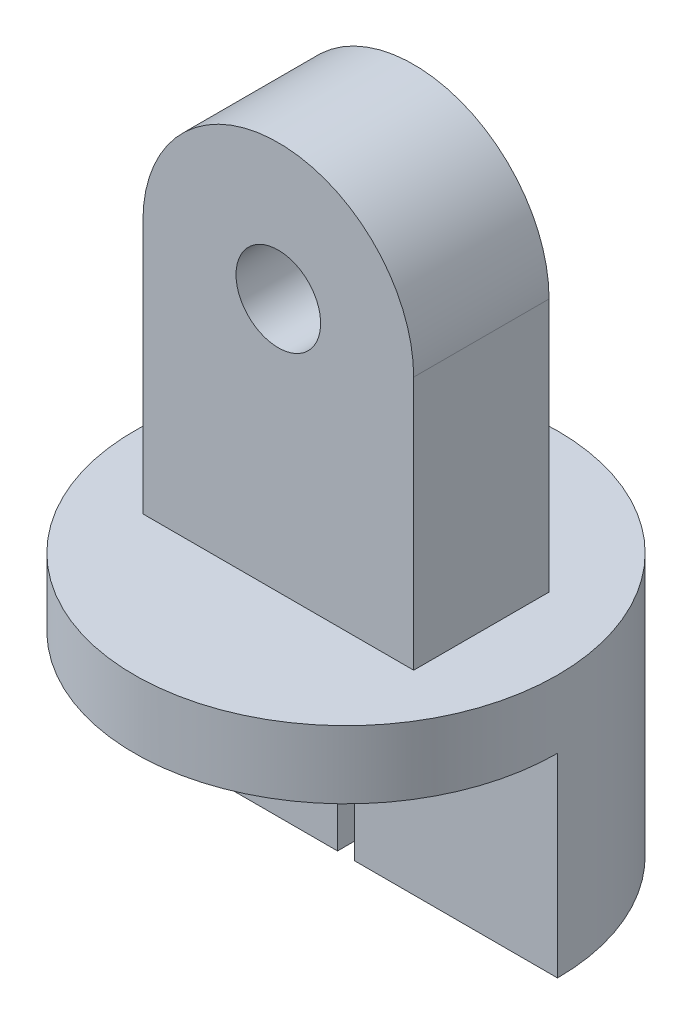
ISO-10303-21;
HEADER;
FILE_DESCRIPTION(('STEP AP214'),'2;1');
FILE_NAME('part.step','',(''),(''),'','','');
FILE_SCHEMA(('AUTOMOTIVE_DESIGN { 1 0 10303 214 1 1 1 1 }'));
ENDSEC;
DATA;
#1=APPLICATION_CONTEXT('core data for automotive mechanical design processes');
#2=APPLICATION_PROTOCOL_DEFINITION('international standard','automotive_design',2000,#1);
#3=PRODUCT_CONTEXT('',#1,'mechanical');
#4=PRODUCT('Part','Part','',(#3));
#5=PRODUCT_RELATED_PRODUCT_CATEGORY('part','',(#4));
#6=PRODUCT_DEFINITION_FORMATION('','',#4);
#7=PRODUCT_DEFINITION_CONTEXT('part definition',#1,'design');
#8=PRODUCT_DEFINITION('design','',#6,#7);
#9=PRODUCT_DEFINITION_SHAPE('','',#8);
#10=(LENGTH_UNIT() NAMED_UNIT(*) SI_UNIT(.MILLI.,.METRE.));
#11=(NAMED_UNIT(*) PLANE_ANGLE_UNIT() SI_UNIT($,.RADIAN.));
#12=(NAMED_UNIT(*) SI_UNIT($,.STERADIAN.) SOLID_ANGLE_UNIT());
#13=UNCERTAINTY_MEASURE_WITH_UNIT(LENGTH_MEASURE(1.E-05),#10,'distance_accuracy_value','');
#14=(GEOMETRIC_REPRESENTATION_CONTEXT(3) GLOBAL_UNCERTAINTY_ASSIGNED_CONTEXT((#13)) GLOBAL_UNIT_ASSIGNED_CONTEXT((#10,
#11,#12)) REPRESENTATION_CONTEXT('',''));
#15=CARTESIAN_POINT('',(0.,0.,0.));
#16=DIRECTION('',(0.,0.,1.));
#17=DIRECTION('',(1.,0.,0.));
#18=AXIS2_PLACEMENT_3D('',#15,#16,#17);
#19=CARTESIAN_POINT('',(10.5,-20.5,0.));
#20=DIRECTION('',(0.,0.,-1.));
#21=DIRECTION('',(-1.,0.,0.));
#22=AXIS2_PLACEMENT_3D('',#19,#20,#21);
#23=PLANE('',#22);
#24=DIRECTION('',(-1.,0.,0.));
#25=VECTOR('',#24,1.);
#26=CARTESIAN_POINT('',(-12.5,-20.5,0.));
#27=LINE('',#26,#25);
#28=CARTESIAN_POINT('',(10.5,-20.5,0.));
#29=VERTEX_POINT('',#28);
#30=CARTESIAN_POINT('',(0.500000000000001,-20.5,0.));
#31=VERTEX_POINT('',#30);
#32=EDGE_CURVE('E148',#29,#31,#27,.T.);
#33=ORIENTED_EDGE('',*,*,#32,.T.);
#34=DIRECTION('',(0.,-1.,0.));
#35=VECTOR('',#34,1.);
#36=CARTESIAN_POINT('',(0.500000000000001,8.001,0.));
#37=LINE('',#36,#35);
#38=CARTESIAN_POINT('',(0.500000000000001,-30.5,0.));
#39=VERTEX_POINT('',#38);
#40=EDGE_CURVE('E141',#31,#39,#37,.T.);
#41=ORIENTED_EDGE('',*,*,#40,.T.);
#42=DIRECTION('',(-1.,0.,0.));
#43=VECTOR('',#42,1.);
#44=CARTESIAN_POINT('',(-12.5,-30.5,0.));
#45=LINE('',#44,#43);
#46=CARTESIAN_POINT('',(12.5,-30.5,0.));
#47=VERTEX_POINT('',#46);
#48=EDGE_CURVE('E161',#47,#39,#45,.T.);
#49=ORIENTED_EDGE('',*,*,#48,.F.);
#50=DIRECTION('',(0.,1.,0.));
#51=VECTOR('',#50,1.);
#52=CARTESIAN_POINT('',(12.5,-20.5,0.));
#53=LINE('',#52,#51);
#54=CARTESIAN_POINT('',(12.5,-19.,0.));
#55=VERTEX_POINT('',#54);
#56=EDGE_CURVE('E179',#47,#55,#53,.T.);
#57=ORIENTED_EDGE('',*,*,#56,.T.);
#58=DIRECTION('',(-1.,0.,0.));
#59=VECTOR('',#58,1.);
#60=CARTESIAN_POINT('',(10.5,-19.,0.));
#61=LINE('',#60,#59);
#62=CARTESIAN_POINT('',(10.5,-19.,0.));
#63=VERTEX_POINT('',#62);
#64=EDGE_CURVE('E163',#55,#63,#61,.T.);
#65=ORIENTED_EDGE('',*,*,#64,.T.);
#66=DIRECTION('',(0.,1.,0.));
#67=VECTOR('',#66,1.);
#68=CARTESIAN_POINT('',(10.5,-20.5,0.));
#69=LINE('',#68,#67);
#70=EDGE_CURVE('E177',#29,#63,#69,.T.);
#71=ORIENTED_EDGE('',*,*,#70,.F.);
#72=EDGE_LOOP('',(#33,#41,#49,#57,#65,#71));
#73=FACE_BOUND('',#72,.T.);
#74=ADVANCED_FACE('F33',(#73),#23,.F.);
#75=CARTESIAN_POINT('',(0.,0.,4.));
#76=DIRECTION('',(0.,0.,-1.));
#77=DIRECTION('',(-1.,0.,0.));
#78=AXIS2_PLACEMENT_3D('',#75,#76,#77);
#79=CYLINDRICAL_SURFACE('',#78,8.);
#80=CARTESIAN_POINT('',(0.,0.,-4.));
#81=DIRECTION('',(0.,0.,1.));
#82=DIRECTION('',(1.,0.,0.));
#83=AXIS2_PLACEMENT_3D('',#80,#81,#82);
#84=CIRCLE('',#83,8.);
#85=CARTESIAN_POINT('',(8.,0.,-4.));
#86=VERTEX_POINT('',#85);
#87=CARTESIAN_POINT('',(-8.,0.,-4.));
#88=VERTEX_POINT('',#87);
#89=EDGE_CURVE('E201',#86,#88,#84,.T.);
#90=ORIENTED_EDGE('',*,*,#89,.T.);
#91=DIRECTION('',(0.,0.,-1.));
#92=VECTOR('',#91,1.);
#93=CARTESIAN_POINT('',(-8.,0.,4.));
#94=LINE('',#93,#92);
#95=CARTESIAN_POINT('',(-8.,0.,4.));
#96=VERTEX_POINT('',#95);
#97=EDGE_CURVE('E11',#96,#88,#94,.T.);
#98=ORIENTED_EDGE('',*,*,#97,.F.);
#99=CARTESIAN_POINT('',(0.,0.,4.));
#100=DIRECTION('',(0.,0.,1.));
#101=DIRECTION('',(1.,0.,0.));
#102=AXIS2_PLACEMENT_3D('',#99,#100,#101);
#103=CIRCLE('',#102,8.);
#104=CARTESIAN_POINT('',(8.,0.,4.));
#105=VERTEX_POINT('',#104);
#106=EDGE_CURVE('E205',#105,#96,#103,.T.);
#107=ORIENTED_EDGE('',*,*,#106,.F.);
#108=DIRECTION('',(0.,0.,-1.));
#109=VECTOR('',#108,1.);
#110=CARTESIAN_POINT('',(8.,0.,4.));
#111=LINE('',#110,#109);
#112=EDGE_CURVE('E215',#105,#86,#111,.T.);
#113=ORIENTED_EDGE('',*,*,#112,.T.);
#114=EDGE_LOOP('',(#90,#98,#107,#113));
#115=FACE_BOUND('',#114,.T.);
#116=ADVANCED_FACE('F35',(#115),#79,.T.);
#117=CARTESIAN_POINT('',(-8.,0.,4.));
#118=DIRECTION('',(1.,0.,0.));
#119=DIRECTION('',(0.,1.,0.));
#120=AXIS2_PLACEMENT_3D('',#117,#118,#119);
#121=PLANE('',#120);
#122=DIRECTION('',(0.,-1.,0.));
#123=VECTOR('',#122,1.);
#124=CARTESIAN_POINT('',(-8.,0.,-4.));
#125=LINE('',#124,#123);
#126=CARTESIAN_POINT('',(-8.00000000000001,-15.,-4.));
#127=VERTEX_POINT('',#126);
#128=EDGE_CURVE('E218',#88,#127,#125,.T.);
#129=ORIENTED_EDGE('',*,*,#128,.T.);
#130=DIRECTION('',(0.,0.,-1.));
#131=VECTOR('',#130,1.);
#132=CARTESIAN_POINT('',(-8.00000000000001,-15.,4.));
#133=LINE('',#132,#131);
#134=CARTESIAN_POINT('',(-8.00000000000001,-15.,4.));
#135=VERTEX_POINT('',#134);
#136=EDGE_CURVE('E43',#135,#127,#133,.T.);
#137=ORIENTED_EDGE('',*,*,#136,.F.);
#138=DIRECTION('',(0.,-1.,0.));
#139=VECTOR('',#138,1.);
#140=CARTESIAN_POINT('',(-8.,0.,4.));
#141=LINE('',#140,#139);
#142=EDGE_CURVE('E208',#96,#135,#141,.T.);
#143=ORIENTED_EDGE('',*,*,#142,.F.);
#144=ORIENTED_EDGE('',*,*,#97,.T.);
#145=EDGE_LOOP('',(#129,#137,#143,#144));
#146=FACE_BOUND('',#145,.T.);
#147=ADVANCED_FACE('F277',(#146),#121,.F.);
#148=CARTESIAN_POINT('',(8.,0.,4.));
#149=DIRECTION('',(-1.,0.,0.));
#150=DIRECTION('',(0.,-1.,0.));
#151=AXIS2_PLACEMENT_3D('',#148,#149,#150);
#152=PLANE('',#151);
#153=DIRECTION('',(0.,1.,0.));
#154=VECTOR('',#153,1.);
#155=CARTESIAN_POINT('',(8.,0.,-4.));
#156=LINE('',#155,#154);
#157=CARTESIAN_POINT('',(8.00000000000001,-15.,-4.));
#158=VERTEX_POINT('',#157);
#159=EDGE_CURVE('E209',#158,#86,#156,.T.);
#160=ORIENTED_EDGE('',*,*,#159,.T.);
#161=ORIENTED_EDGE('',*,*,#112,.F.);
#162=DIRECTION('',(0.,1.,0.));
#163=VECTOR('',#162,1.);
#164=CARTESIAN_POINT('',(8.,0.,4.));
#165=LINE('',#164,#163);
#166=CARTESIAN_POINT('',(8.00000000000001,-15.,4.));
#167=VERTEX_POINT('',#166);
#168=EDGE_CURVE('E213',#167,#105,#165,.T.);
#169=ORIENTED_EDGE('',*,*,#168,.F.);
#170=DIRECTION('',(0.,0.,-1.));
#171=VECTOR('',#170,1.);
#172=CARTESIAN_POINT('',(8.00000000000001,-15.,4.));
#173=LINE('',#172,#171);
#174=EDGE_CURVE('E226',#167,#158,#173,.T.);
#175=ORIENTED_EDGE('',*,*,#174,.T.);
#176=EDGE_LOOP('',(#160,#161,#169,#175));
#177=FACE_BOUND('',#176,.T.);
#178=ADVANCED_FACE('F305',(#177),#152,.F.);
#179=CARTESIAN_POINT('',(0.,0.,4.));
#180=DIRECTION('',(0.,0.,1.));
#181=DIRECTION('',(1.,0.,0.));
#182=AXIS2_PLACEMENT_3D('',#179,#180,#181);
#183=PLANE('',#182);
#184=CARTESIAN_POINT('',(0.,0.,4.));
#185=DIRECTION('',(0.,0.,-1.));
#186=DIRECTION('',(-1.,0.,0.));
#187=AXIS2_PLACEMENT_3D('',#184,#185,#186);
#188=CIRCLE('',#187,2.5);
#189=CARTESIAN_POINT('',(-2.5,0.,4.));
#190=VERTEX_POINT('',#189);
#191=EDGE_CURVE('E198',#190,#190,#188,.T.);
#192=ORIENTED_EDGE('',*,*,#191,.T.);
#193=EDGE_LOOP('',(#192));
#194=FACE_BOUND('',#193,.T.);
#195=ORIENTED_EDGE('',*,*,#106,.T.);
#196=ORIENTED_EDGE('',*,*,#142,.T.);
#197=DIRECTION('',(1.,0.,0.));
#198=VECTOR('',#197,1.);
#199=CARTESIAN_POINT('',(8.00000000000001,-15.,4.));
#200=LINE('',#199,#198);
#201=EDGE_CURVE('E211',#135,#167,#200,.T.);
#202=ORIENTED_EDGE('',*,*,#201,.T.);
#203=ORIENTED_EDGE('',*,*,#168,.T.);
#204=EDGE_LOOP('',(#195,#196,#202,#203));
#205=FACE_BOUND('',#204,.T.);
#206=ADVANCED_FACE('F302',(#194,#205),#183,.T.);
#207=CARTESIAN_POINT('',(0.,0.,-4.));
#208=DIRECTION('',(0.,0.,1.));
#209=DIRECTION('',(1.,0.,0.));
#210=AXIS2_PLACEMENT_3D('',#207,#208,#209);
#211=PLANE('',#210);
#212=CARTESIAN_POINT('',(0.,0.,-4.));
#213=DIRECTION('',(0.,0.,-1.));
#214=DIRECTION('',(-1.,0.,0.));
#215=AXIS2_PLACEMENT_3D('',#212,#213,#214);
#216=CIRCLE('',#215,2.5);
#217=CARTESIAN_POINT('',(-2.5,0.,-4.));
#218=VERTEX_POINT('',#217);
#219=EDGE_CURVE('E202',#218,#218,#216,.T.);
#220=ORIENTED_EDGE('',*,*,#219,.F.);
#221=EDGE_LOOP('',(#220));
#222=FACE_BOUND('',#221,.T.);
#223=ORIENTED_EDGE('',*,*,#89,.F.);
#224=ORIENTED_EDGE('',*,*,#159,.F.);
#225=DIRECTION('',(1.,0.,0.));
#226=VECTOR('',#225,1.);
#227=CARTESIAN_POINT('',(8.00000000000001,-15.,-4.));
#228=LINE('',#227,#226);
#229=EDGE_CURVE('E220',#127,#158,#228,.T.);
#230=ORIENTED_EDGE('',*,*,#229,.F.);
#231=ORIENTED_EDGE('',*,*,#128,.F.);
#232=EDGE_LOOP('',(#223,#224,#230,#231));
#233=FACE_BOUND('',#232,.T.);
#234=ADVANCED_FACE('F300',(#222,#233),#211,.F.);
#235=CARTESIAN_POINT('',(0.,0.,4.));
#236=DIRECTION('',(0.,0.,-1.));
#237=DIRECTION('',(-1.,0.,0.));
#238=AXIS2_PLACEMENT_3D('',#235,#236,#237);
#239=CYLINDRICAL_SURFACE('',#238,2.5);
#240=ORIENTED_EDGE('',*,*,#191,.F.);
#241=EDGE_LOOP('',(#240));
#242=FACE_BOUND('',#241,.T.);
#243=ORIENTED_EDGE('',*,*,#219,.T.);
#244=EDGE_LOOP('',(#243));
#245=FACE_BOUND('',#244,.T.);
#246=ADVANCED_FACE('F297',(#242,#245),#239,.F.);
#247=CARTESIAN_POINT('',(0.,-19.,0.));
#248=DIRECTION('',(0.,1.,0.));
#249=DIRECTION('',(0.,0.,1.));
#250=AXIS2_PLACEMENT_3D('',#247,#248,#249);
#251=CYLINDRICAL_SURFACE('',#250,12.5);
#252=CARTESIAN_POINT('',(0.,-19.,0.));
#253=DIRECTION('',(0.,-1.,0.));
#254=DIRECTION('',(0.,0.,-1.));
#255=AXIS2_PLACEMENT_3D('',#252,#253,#254);
#256=CIRCLE('',#255,12.5);
#257=CARTESIAN_POINT('',(-12.5,-19.,0.));
#258=VERTEX_POINT('',#257);
#259=EDGE_CURVE('E197',#55,#258,#256,.T.);
#260=ORIENTED_EDGE('',*,*,#259,.F.);
#261=ORIENTED_EDGE('',*,*,#56,.F.);
#262=CARTESIAN_POINT('',(0.,-30.5,0.));
#263=DIRECTION('',(0.,-1.,0.));
#264=DIRECTION('',(0.,0.,-1.));
#265=AXIS2_PLACEMENT_3D('',#262,#263,#264);
#266=CIRCLE('',#265,12.5);
#267=CARTESIAN_POINT('',(-12.5,-30.5,0.));
#268=VERTEX_POINT('',#267);
#269=EDGE_CURVE('E150',#268,#47,#266,.T.);
#270=ORIENTED_EDGE('',*,*,#269,.F.);
#271=DIRECTION('',(0.,1.,0.));
#272=VECTOR('',#271,1.);
#273=CARTESIAN_POINT('',(-12.5,-20.5,0.));
#274=LINE('',#273,#272);
#275=EDGE_CURVE('E174',#268,#258,#274,.T.);
#276=ORIENTED_EDGE('',*,*,#275,.T.);
#277=EDGE_LOOP('',(#260,#261,#270,#276));
#278=FACE_BOUND('',#277,.T.);
#279=CARTESIAN_POINT('',(0.,-15.,0.));
#280=DIRECTION('',(0.,-1.,0.));
#281=DIRECTION('',(0.,0.,-1.));
#282=AXIS2_PLACEMENT_3D('',#279,#280,#281);
#283=CIRCLE('',#282,12.5);
#284=CARTESIAN_POINT('',(0.,-15.,-12.5));
#285=VERTEX_POINT('',#284);
#286=EDGE_CURVE('E184',#285,#285,#283,.T.);
#287=ORIENTED_EDGE('',*,*,#286,.T.);
#288=EDGE_LOOP('',(#287));
#289=FACE_BOUND('',#288,.T.);
#290=ADVANCED_FACE('F242',(#278,#289),#251,.T.);
#291=CARTESIAN_POINT('',(0.,-19.,0.));
#292=DIRECTION('',(0.,-1.,0.));
#293=DIRECTION('',(0.,0.,-1.));
#294=AXIS2_PLACEMENT_3D('',#291,#292,#293);
#295=PLANE('',#294);
#296=DIRECTION('',(-1.,0.,0.));
#297=VECTOR('',#296,1.);
#298=CARTESIAN_POINT('',(-12.5,-19.,0.));
#299=LINE('',#298,#297);
#300=CARTESIAN_POINT('',(-10.5,-19.,0.));
#301=VERTEX_POINT('',#300);
#302=EDGE_CURVE('E59',#301,#258,#299,.T.);
#303=ORIENTED_EDGE('',*,*,#302,.F.);
#304=CARTESIAN_POINT('',(0.,-19.,0.));
#305=DIRECTION('',(0.,1.,0.));
#306=DIRECTION('',(0.,0.,-1.));
#307=AXIS2_PLACEMENT_3D('',#304,#305,#306);
#308=CIRCLE('',#307,10.5);
#309=EDGE_CURVE('E169',#63,#301,#308,.T.);
#310=ORIENTED_EDGE('',*,*,#309,.F.);
#311=ORIENTED_EDGE('',*,*,#64,.F.);
#312=ORIENTED_EDGE('',*,*,#259,.T.);
#313=EDGE_LOOP('',(#303,#310,#311,#312));
#314=FACE_BOUND('',#313,.T.);
#315=ADVANCED_FACE('F239',(#314),#295,.T.);
#316=CARTESIAN_POINT('',(0.,-15.,0.));
#317=DIRECTION('',(0.,-1.,0.));
#318=DIRECTION('',(0.,0.,-1.));
#319=AXIS2_PLACEMENT_3D('',#316,#317,#318);
#320=PLANE('',#319);
#321=ORIENTED_EDGE('',*,*,#201,.F.);
#322=ORIENTED_EDGE('',*,*,#136,.T.);
#323=ORIENTED_EDGE('',*,*,#229,.T.);
#324=ORIENTED_EDGE('',*,*,#174,.F.);
#325=EDGE_LOOP('',(#321,#322,#323,#324));
#326=FACE_BOUND('',#325,.T.);
#327=ORIENTED_EDGE('',*,*,#286,.F.);
#328=EDGE_LOOP('',(#327));
#329=FACE_BOUND('',#328,.T.);
#330=ADVANCED_FACE('F282',(#326,#329),#320,.F.);
#331=CARTESIAN_POINT('',(-0.5,-30.5,0.));
#332=VERTEX_POINT('',#331);
#333=EDGE_CURVE('E140',#332,#268,#45,.T.);
#334=ORIENTED_EDGE('',*,*,#333,.F.);
#335=DIRECTION('',(0.,-1.,0.));
#336=VECTOR('',#335,1.);
#337=CARTESIAN_POINT('',(-0.500000000000001,8.001,0.));
#338=LINE('',#337,#336);
#339=CARTESIAN_POINT('',(-0.500000000000001,-20.5,0.));
#340=VERTEX_POINT('',#339);
#341=EDGE_CURVE('E51',#340,#332,#338,.T.);
#342=ORIENTED_EDGE('',*,*,#341,.F.);
#343=CARTESIAN_POINT('',(-10.5,-20.5,0.));
#344=VERTEX_POINT('',#343);
#345=EDGE_CURVE('E37',#340,#344,#27,.T.);
#346=ORIENTED_EDGE('',*,*,#345,.T.);
#347=DIRECTION('',(0.,1.,0.));
#348=VECTOR('',#347,1.);
#349=CARTESIAN_POINT('',(-10.5,-20.5,0.));
#350=LINE('',#349,#348);
#351=EDGE_CURVE('E180',#344,#301,#350,.T.);
#352=ORIENTED_EDGE('',*,*,#351,.T.);
#353=ORIENTED_EDGE('',*,*,#302,.T.);
#354=ORIENTED_EDGE('',*,*,#275,.F.);
#355=EDGE_LOOP('',(#334,#342,#346,#352,#353,#354));
#356=FACE_BOUND('',#355,.T.);
#357=ADVANCED_FACE('F136',(#356),#23,.F.);
#358=CARTESIAN_POINT('',(0.,-20.5,0.));
#359=DIRECTION('',(0.,1.,0.));
#360=DIRECTION('',(0.,0.,1.));
#361=AXIS2_PLACEMENT_3D('',#358,#359,#360);
#362=CYLINDRICAL_SURFACE('',#361,10.5);
#363=ORIENTED_EDGE('',*,*,#309,.T.);
#364=ORIENTED_EDGE('',*,*,#351,.F.);
#365=CARTESIAN_POINT('',(0.,-20.5,0.));
#366=DIRECTION('',(0.,1.,0.));
#367=DIRECTION('',(0.,0.,-1.));
#368=AXIS2_PLACEMENT_3D('',#365,#366,#367);
#369=CIRCLE('',#368,10.5);
#370=EDGE_CURVE('E147',#29,#344,#369,.T.);
#371=ORIENTED_EDGE('',*,*,#370,.F.);
#372=ORIENTED_EDGE('',*,*,#70,.T.);
#373=EDGE_LOOP('',(#363,#364,#371,#372));
#374=FACE_BOUND('',#373,.T.);
#375=ADVANCED_FACE('F238',(#374),#362,.F.);
#376=CARTESIAN_POINT('',(0.,-20.5,0.));
#377=DIRECTION('',(0.,-1.,0.));
#378=DIRECTION('',(0.,0.,-1.));
#379=AXIS2_PLACEMENT_3D('',#376,#377,#378);
#380=PLANE('',#379);
#381=DIRECTION('',(-1.,0.,0.));
#382=VECTOR('',#381,1.);
#383=CARTESIAN_POINT('',(-0.5,-20.5,-7.));
#384=LINE('',#383,#382);
#385=CARTESIAN_POINT('',(0.5,-20.5,-7.));
#386=VERTEX_POINT('',#385);
#387=CARTESIAN_POINT('',(-0.5,-20.5,-7.));
#388=VERTEX_POINT('',#387);
#389=EDGE_CURVE('E132',#386,#388,#384,.T.);
#390=ORIENTED_EDGE('',*,*,#389,.F.);
#391=DIRECTION('',(0.,0.,-1.));
#392=VECTOR('',#391,1.);
#393=CARTESIAN_POINT('',(0.500000000000001,-20.5,0.));
#394=LINE('',#393,#392);
#395=EDGE_CURVE('E131',#31,#386,#394,.T.);
#396=ORIENTED_EDGE('',*,*,#395,.F.);
#397=ORIENTED_EDGE('',*,*,#32,.F.);
#398=ORIENTED_EDGE('',*,*,#370,.T.);
#399=ORIENTED_EDGE('',*,*,#345,.F.);
#400=DIRECTION('',(0.,0.,1.));
#401=VECTOR('',#400,1.);
#402=CARTESIAN_POINT('',(-0.500000000000001,-20.5,0.));
#403=LINE('',#402,#401);
#404=EDGE_CURVE('E124',#388,#340,#403,.T.);
#405=ORIENTED_EDGE('',*,*,#404,.F.);
#406=EDGE_LOOP('',(#390,#396,#397,#398,#399,#405));
#407=FACE_BOUND('',#406,.T.);
#408=ADVANCED_FACE('F144',(#407),#380,.F.);
#409=CARTESIAN_POINT('',(0.,-30.5,0.));
#410=DIRECTION('',(0.,-1.,0.));
#411=DIRECTION('',(0.,0.,-1.));
#412=AXIS2_PLACEMENT_3D('',#409,#410,#411);
#413=PLANE('',#412);
#414=DIRECTION('',(0.,0.,1.));
#415=VECTOR('',#414,1.);
#416=CARTESIAN_POINT('',(0.500000000000001,-30.5,0.));
#417=LINE('',#416,#415);
#418=CARTESIAN_POINT('',(0.5,-30.5,-7.));
#419=VERTEX_POINT('',#418);
#420=EDGE_CURVE('E254',#419,#39,#417,.T.);
#421=ORIENTED_EDGE('',*,*,#420,.F.);
#422=DIRECTION('',(1.,0.,0.));
#423=VECTOR('',#422,1.);
#424=CARTESIAN_POINT('',(-0.5,-30.5,-7.));
#425=LINE('',#424,#423);
#426=CARTESIAN_POINT('',(-0.5,-30.5,-7.));
#427=VERTEX_POINT('',#426);
#428=EDGE_CURVE('E252',#427,#419,#425,.T.);
#429=ORIENTED_EDGE('',*,*,#428,.F.);
#430=DIRECTION('',(0.,0.,-1.));
#431=VECTOR('',#430,1.);
#432=CARTESIAN_POINT('',(-0.500000000000001,-30.5,0.));
#433=LINE('',#432,#431);
#434=EDGE_CURVE('E251',#332,#427,#433,.T.);
#435=ORIENTED_EDGE('',*,*,#434,.F.);
#436=ORIENTED_EDGE('',*,*,#333,.T.);
#437=ORIENTED_EDGE('',*,*,#269,.T.);
#438=ORIENTED_EDGE('',*,*,#48,.T.);
#439=EDGE_LOOP('',(#421,#429,#435,#436,#437,#438));
#440=FACE_BOUND('',#439,.T.);
#441=ADVANCED_FACE('F249',(#440),#413,.T.);
#442=CARTESIAN_POINT('',(-0.5,8.001,-7.));
#443=DIRECTION('',(0.,0.,-1.));
#444=DIRECTION('',(-1.,0.,0.));
#445=AXIS2_PLACEMENT_3D('',#442,#443,#444);
#446=PLANE('',#445);
#447=ORIENTED_EDGE('',*,*,#389,.T.);
#448=DIRECTION('',(0.,-1.,0.));
#449=VECTOR('',#448,1.);
#450=CARTESIAN_POINT('',(-0.5,8.001,-7.));
#451=LINE('',#450,#449);
#452=EDGE_CURVE('E126',#388,#427,#451,.T.);
#453=ORIENTED_EDGE('',*,*,#452,.T.);
#454=ORIENTED_EDGE('',*,*,#428,.T.);
#455=DIRECTION('',(0.,-1.,0.));
#456=VECTOR('',#455,1.);
#457=CARTESIAN_POINT('',(0.5,8.001,-7.));
#458=LINE('',#457,#456);
#459=EDGE_CURVE('E157',#386,#419,#458,.T.);
#460=ORIENTED_EDGE('',*,*,#459,.F.);
#461=EDGE_LOOP('',(#447,#453,#454,#460));
#462=FACE_BOUND('',#461,.T.);
#463=ADVANCED_FACE('F261',(#462),#446,.F.);
#464=CARTESIAN_POINT('',(0.500000000000001,8.001,0.));
#465=DIRECTION('',(1.,0.,0.));
#466=DIRECTION('',(0.,0.,-1.));
#467=AXIS2_PLACEMENT_3D('',#464,#465,#466);
#468=PLANE('',#467);
#469=ORIENTED_EDGE('',*,*,#395,.T.);
#470=ORIENTED_EDGE('',*,*,#459,.T.);
#471=ORIENTED_EDGE('',*,*,#420,.T.);
#472=ORIENTED_EDGE('',*,*,#40,.F.);
#473=EDGE_LOOP('',(#469,#470,#471,#472));
#474=FACE_BOUND('',#473,.T.);
#475=ADVANCED_FACE('F263',(#474),#468,.F.);
#476=CARTESIAN_POINT('',(-0.500000000000001,8.001,0.));
#477=DIRECTION('',(-1.,0.,0.));
#478=DIRECTION('',(0.,0.,1.));
#479=AXIS2_PLACEMENT_3D('',#476,#477,#478);
#480=PLANE('',#479);
#481=ORIENTED_EDGE('',*,*,#404,.T.);
#482=ORIENTED_EDGE('',*,*,#341,.T.);
#483=ORIENTED_EDGE('',*,*,#434,.T.);
#484=ORIENTED_EDGE('',*,*,#452,.F.);
#485=EDGE_LOOP('',(#481,#482,#483,#484));
#486=FACE_BOUND('',#485,.T.);
#487=ADVANCED_FACE('F125',(#486),#480,.F.);
#488=CLOSED_SHELL('',(#74,#116,#147,#178,#206,#234,#246,#290,#315,#330,#357,#375,#408,#441,#463,
#475,#487));
#489=MANIFOLD_SOLID_BREP('B2',#488);
#490=ADVANCED_BREP_SHAPE_REPRESENTATION('',(#18,#489),#14);
#491=SHAPE_DEFINITION_REPRESENTATION(#9,#490);
ENDSEC;
END-ISO-10303-21;
